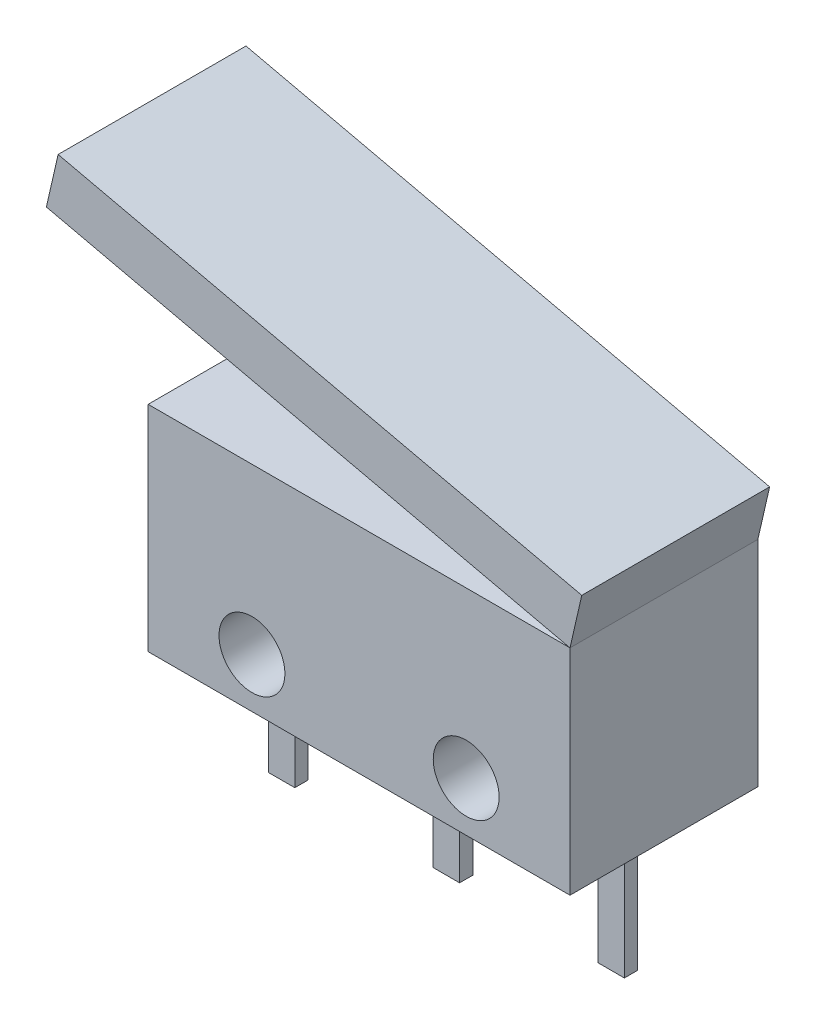
ISO-10303-21;
HEADER;
FILE_DESCRIPTION(('STEP AP214'),'2;1');
FILE_NAME('part.step','',(''),(''),'','','');
FILE_SCHEMA(('AUTOMOTIVE_DESIGN { 1 0 10303 214 1 1 1 1 }'));
ENDSEC;
DATA;
#1=APPLICATION_CONTEXT('core data for automotive mechanical design processes');
#2=APPLICATION_PROTOCOL_DEFINITION('international standard','automotive_design',2000,#1);
#3=PRODUCT_CONTEXT('',#1,'mechanical');
#4=PRODUCT('Part','Part','',(#3));
#5=PRODUCT_RELATED_PRODUCT_CATEGORY('part','',(#4));
#6=PRODUCT_DEFINITION_FORMATION('','',#4);
#7=PRODUCT_DEFINITION_CONTEXT('part definition',#1,'design');
#8=PRODUCT_DEFINITION('design','',#6,#7);
#9=PRODUCT_DEFINITION_SHAPE('','',#8);
#10=(LENGTH_UNIT() NAMED_UNIT(*) SI_UNIT(.MILLI.,.METRE.));
#11=(NAMED_UNIT(*) PLANE_ANGLE_UNIT() SI_UNIT($,.RADIAN.));
#12=(NAMED_UNIT(*) SI_UNIT($,.STERADIAN.) SOLID_ANGLE_UNIT());
#13=UNCERTAINTY_MEASURE_WITH_UNIT(LENGTH_MEASURE(1.E-05),#10,'distance_accuracy_value','');
#14=(GEOMETRIC_REPRESENTATION_CONTEXT(3) GLOBAL_UNCERTAINTY_ASSIGNED_CONTEXT((#13)) GLOBAL_UNIT_ASSIGNED_CONTEXT((#10,
#11,#12)) REPRESENTATION_CONTEXT('',''));
#15=CARTESIAN_POINT('',(0.,0.,0.));
#16=DIRECTION('',(0.,0.,1.));
#17=DIRECTION('',(1.,0.,0.));
#18=AXIS2_PLACEMENT_3D('',#15,#16,#17);
#19=CARTESIAN_POINT('',(0.,0.,5.7));
#20=DIRECTION('',(0.,1.,0.));
#21=DIRECTION('',(0.,0.,1.));
#22=AXIS2_PLACEMENT_3D('',#19,#20,#21);
#23=PLANE('',#22);
#24=DIRECTION('',(-1.,0.,0.));
#25=VECTOR('',#24,1.);
#26=CARTESIAN_POINT('',(6.,0.,3.05));
#27=LINE('',#26,#25);
#28=CARTESIAN_POINT('',(6.8,0.,3.05));
#29=VERTEX_POINT('',#28);
#30=CARTESIAN_POINT('',(6.,0.,3.05));
#31=VERTEX_POINT('',#30);
#32=EDGE_CURVE('E178',#29,#31,#27,.T.);
#33=ORIENTED_EDGE('',*,*,#32,.F.);
#34=DIRECTION('',(0.,0.,1.));
#35=VECTOR('',#34,1.);
#36=CARTESIAN_POINT('',(6.8,0.,3.05));
#37=LINE('',#36,#35);
#38=CARTESIAN_POINT('',(6.8,0.,2.65));
#39=VERTEX_POINT('',#38);
#40=EDGE_CURVE('E191',#39,#29,#37,.T.);
#41=ORIENTED_EDGE('',*,*,#40,.F.);
#42=DIRECTION('',(1.,0.,0.));
#43=VECTOR('',#42,1.);
#44=CARTESIAN_POINT('',(6.8,0.,2.65));
#45=LINE('',#44,#43);
#46=CARTESIAN_POINT('',(6.,0.,2.65));
#47=VERTEX_POINT('',#46);
#48=EDGE_CURVE('E200',#47,#39,#45,.T.);
#49=ORIENTED_EDGE('',*,*,#48,.F.);
#50=DIRECTION('',(0.,0.,-1.));
#51=VECTOR('',#50,1.);
#52=CARTESIAN_POINT('',(6.,0.,3.05));
#53=LINE('',#52,#51);
#54=EDGE_CURVE('E181',#31,#47,#53,.T.);
#55=ORIENTED_EDGE('',*,*,#54,.F.);
#56=EDGE_LOOP('',(#33,#41,#49,#55));
#57=FACE_BOUND('',#56,.T.);
#58=DIRECTION('',(1.,0.,0.));
#59=VECTOR('',#58,1.);
#60=CARTESIAN_POINT('',(0.,0.,0.));
#61=LINE('',#60,#59);
#62=CARTESIAN_POINT('',(0.,0.,0.));
#63=VERTEX_POINT('',#62);
#64=CARTESIAN_POINT('',(12.8,0.,0.));
#65=VERTEX_POINT('',#64);
#66=EDGE_CURVE('E259',#63,#65,#61,.T.);
#67=ORIENTED_EDGE('',*,*,#66,.T.);
#68=DIRECTION('',(0.,0.,-1.));
#69=VECTOR('',#68,1.);
#70=CARTESIAN_POINT('',(12.8,0.,5.7));
#71=LINE('',#70,#69);
#72=CARTESIAN_POINT('',(12.8,0.,5.7));
#73=VERTEX_POINT('',#72);
#74=EDGE_CURVE('E12',#73,#65,#71,.T.);
#75=ORIENTED_EDGE('',*,*,#74,.F.);
#76=DIRECTION('',(1.,0.,0.));
#77=VECTOR('',#76,1.);
#78=CARTESIAN_POINT('',(0.,0.,5.7));
#79=LINE('',#78,#77);
#80=CARTESIAN_POINT('',(0.,0.,5.7));
#81=VERTEX_POINT('',#80);
#82=EDGE_CURVE('E262',#81,#73,#79,.T.);
#83=ORIENTED_EDGE('',*,*,#82,.F.);
#84=DIRECTION('',(0.,0.,-1.));
#85=VECTOR('',#84,1.);
#86=CARTESIAN_POINT('',(0.,0.,5.7));
#87=LINE('',#86,#85);
#88=EDGE_CURVE('E274',#81,#63,#87,.T.);
#89=ORIENTED_EDGE('',*,*,#88,.T.);
#90=EDGE_LOOP('',(#67,#75,#83,#89));
#91=FACE_BOUND('',#90,.T.);
#92=DIRECTION('',(0.,0.,-1.));
#93=VECTOR('',#92,1.);
#94=CARTESIAN_POINT('',(1.,0.,3.05));
#95=LINE('',#94,#93);
#96=CARTESIAN_POINT('',(1.,0.,3.05));
#97=VERTEX_POINT('',#96);
#98=CARTESIAN_POINT('',(1.,0.,2.65));
#99=VERTEX_POINT('',#98);
#100=EDGE_CURVE('E216',#97,#99,#95,.T.);
#101=ORIENTED_EDGE('',*,*,#100,.F.);
#102=DIRECTION('',(-1.,0.,0.));
#103=VECTOR('',#102,1.);
#104=CARTESIAN_POINT('',(1.,0.,3.05));
#105=LINE('',#104,#103);
#106=CARTESIAN_POINT('',(1.8,0.,3.05));
#107=VERTEX_POINT('',#106);
#108=EDGE_CURVE('E221',#107,#97,#105,.T.);
#109=ORIENTED_EDGE('',*,*,#108,.F.);
#110=DIRECTION('',(0.,0.,1.));
#111=VECTOR('',#110,1.);
#112=CARTESIAN_POINT('',(1.8,0.,3.05));
#113=LINE('',#112,#111);
#114=CARTESIAN_POINT('',(1.8,0.,2.65));
#115=VERTEX_POINT('',#114);
#116=EDGE_CURVE('E233',#115,#107,#113,.T.);
#117=ORIENTED_EDGE('',*,*,#116,.F.);
#118=DIRECTION('',(1.,0.,0.));
#119=VECTOR('',#118,1.);
#120=CARTESIAN_POINT('',(1.,0.,2.65));
#121=LINE('',#120,#119);
#122=EDGE_CURVE('E230',#99,#115,#121,.T.);
#123=ORIENTED_EDGE('',*,*,#122,.F.);
#124=EDGE_LOOP('',(#101,#109,#117,#123));
#125=FACE_BOUND('',#124,.T.);
#126=DIRECTION('',(-1.,0.,0.));
#127=VECTOR('',#126,1.);
#128=CARTESIAN_POINT('',(11.8,0.,3.05));
#129=LINE('',#128,#127);
#130=CARTESIAN_POINT('',(11.8,0.,3.05));
#131=VERTEX_POINT('',#130);
#132=CARTESIAN_POINT('',(11.,0.,3.05));
#133=VERTEX_POINT('',#132);
#134=EDGE_CURVE('E177',#131,#133,#129,.T.);
#135=ORIENTED_EDGE('',*,*,#134,.F.);
#136=DIRECTION('',(0.,0.,1.));
#137=VECTOR('',#136,1.);
#138=CARTESIAN_POINT('',(11.8,0.,3.05));
#139=LINE('',#138,#137);
#140=CARTESIAN_POINT('',(11.8,0.,2.65));
#141=VERTEX_POINT('',#140);
#142=EDGE_CURVE('E174',#141,#131,#139,.T.);
#143=ORIENTED_EDGE('',*,*,#142,.F.);
#144=DIRECTION('',(1.,0.,0.));
#145=VECTOR('',#144,1.);
#146=CARTESIAN_POINT('',(11.8,0.,2.65));
#147=LINE('',#146,#145);
#148=CARTESIAN_POINT('',(11.,0.,2.65));
#149=VERTEX_POINT('',#148);
#150=EDGE_CURVE('E64',#149,#141,#147,.T.);
#151=ORIENTED_EDGE('',*,*,#150,.F.);
#152=DIRECTION('',(0.,0.,-1.));
#153=VECTOR('',#152,1.);
#154=CARTESIAN_POINT('',(11.,0.,3.05));
#155=LINE('',#154,#153);
#156=EDGE_CURVE('E59',#133,#149,#155,.T.);
#157=ORIENTED_EDGE('',*,*,#156,.F.);
#158=EDGE_LOOP('',(#135,#143,#151,#157));
#159=FACE_BOUND('',#158,.T.);
#160=ADVANCED_FACE('F45',(#57,#91,#125,#159),#23,.F.);
#161=CARTESIAN_POINT('',(12.8,0.,5.7));
#162=DIRECTION('',(-1.,0.,0.));
#163=DIRECTION('',(0.,0.,1.));
#164=AXIS2_PLACEMENT_3D('',#161,#162,#163);
#165=PLANE('',#164);
#166=DIRECTION('',(0.,1.,0.));
#167=VECTOR('',#166,1.);
#168=CARTESIAN_POINT('',(12.8,0.,0.));
#169=LINE('',#168,#167);
#170=CARTESIAN_POINT('',(12.8,6.5,0.));
#171=VERTEX_POINT('',#170);
#172=EDGE_CURVE('E277',#65,#171,#169,.T.);
#173=ORIENTED_EDGE('',*,*,#172,.T.);
#174=DIRECTION('',(0.,0.,-1.));
#175=VECTOR('',#174,1.);
#176=CARTESIAN_POINT('',(12.8,6.5,5.7));
#177=LINE('',#176,#175);
#178=CARTESIAN_POINT('',(12.8,6.5,5.7));
#179=VERTEX_POINT('',#178);
#180=EDGE_CURVE('E52',#179,#171,#177,.T.);
#181=ORIENTED_EDGE('',*,*,#180,.F.);
#182=DIRECTION('',(0.,1.,0.));
#183=VECTOR('',#182,1.);
#184=CARTESIAN_POINT('',(12.8,0.,5.7));
#185=LINE('',#184,#183);
#186=EDGE_CURVE('E265',#73,#179,#185,.T.);
#187=ORIENTED_EDGE('',*,*,#186,.F.);
#188=ORIENTED_EDGE('',*,*,#74,.T.);
#189=EDGE_LOOP('',(#173,#181,#187,#188));
#190=FACE_BOUND('',#189,.T.);
#191=ADVANCED_FACE('F293',(#190),#165,.F.);
#192=CARTESIAN_POINT('',(0.,6.5,5.7));
#193=DIRECTION('',(0.,1.,0.));
#194=DIRECTION('',(-1.,0.,0.));
#195=AXIS2_PLACEMENT_3D('',#192,#193,#194);
#196=PLANE('',#195);
#197=DIRECTION('',(1.,0.,0.));
#198=VECTOR('',#197,1.);
#199=CARTESIAN_POINT('',(0.,6.5,0.));
#200=LINE('',#199,#198);
#201=CARTESIAN_POINT('',(0.,6.5,0.));
#202=VERTEX_POINT('',#201);
#203=EDGE_CURVE('E280',#202,#171,#200,.T.);
#204=ORIENTED_EDGE('',*,*,#203,.F.);
#205=DIRECTION('',(0.,0.,-1.));
#206=VECTOR('',#205,1.);
#207=CARTESIAN_POINT('',(0.,6.5,5.7));
#208=LINE('',#207,#206);
#209=CARTESIAN_POINT('',(0.,6.5,5.7));
#210=VERTEX_POINT('',#209);
#211=EDGE_CURVE('E286',#210,#202,#208,.T.);
#212=ORIENTED_EDGE('',*,*,#211,.F.);
#213=DIRECTION('',(1.,0.,0.));
#214=VECTOR('',#213,1.);
#215=CARTESIAN_POINT('',(0.,6.5,5.7));
#216=LINE('',#215,#214);
#217=EDGE_CURVE('E268',#210,#179,#216,.T.);
#218=ORIENTED_EDGE('',*,*,#217,.T.);
#219=ORIENTED_EDGE('',*,*,#180,.T.);
#220=EDGE_LOOP('',(#204,#212,#218,#219));
#221=FACE_BOUND('',#220,.T.);
#222=ADVANCED_FACE('F290',(#221),#196,.T.);
#223=CARTESIAN_POINT('',(0.,0.,5.7));
#224=DIRECTION('',(-1.,0.,0.));
#225=DIRECTION('',(0.,0.,1.));
#226=AXIS2_PLACEMENT_3D('',#223,#224,#225);
#227=PLANE('',#226);
#228=DIRECTION('',(0.,1.,0.));
#229=VECTOR('',#228,1.);
#230=CARTESIAN_POINT('',(0.,0.,0.));
#231=LINE('',#230,#229);
#232=EDGE_CURVE('E266',#63,#202,#231,.T.);
#233=ORIENTED_EDGE('',*,*,#232,.F.);
#234=ORIENTED_EDGE('',*,*,#88,.F.);
#235=DIRECTION('',(0.,1.,0.));
#236=VECTOR('',#235,1.);
#237=CARTESIAN_POINT('',(0.,0.,5.7));
#238=LINE('',#237,#236);
#239=EDGE_CURVE('E271',#81,#210,#238,.T.);
#240=ORIENTED_EDGE('',*,*,#239,.T.);
#241=ORIENTED_EDGE('',*,*,#211,.T.);
#242=EDGE_LOOP('',(#233,#234,#240,#241));
#243=FACE_BOUND('',#242,.T.);
#244=ADVANCED_FACE('F300',(#243),#227,.T.);
#245=CARTESIAN_POINT('',(0.,0.,5.7));
#246=DIRECTION('',(0.,0.,1.));
#247=DIRECTION('',(1.,0.,0.));
#248=AXIS2_PLACEMENT_3D('',#245,#246,#247);
#249=PLANE('',#248);
#250=CARTESIAN_POINT('',(9.65,1.5,5.7));
#251=DIRECTION('',(0.,0.,1.));
#252=DIRECTION('',(-1.,0.,0.));
#253=AXIS2_PLACEMENT_3D('',#250,#251,#252);
#254=CIRCLE('',#253,1.);
#255=CARTESIAN_POINT('',(8.65000000000001,1.5,5.7));
#256=VERTEX_POINT('',#255);
#257=EDGE_CURVE('E249',#256,#256,#254,.T.);
#258=ORIENTED_EDGE('',*,*,#257,.F.);
#259=EDGE_LOOP('',(#258));
#260=FACE_BOUND('',#259,.T.);
#261=CARTESIAN_POINT('',(3.15,1.5,5.7));
#262=DIRECTION('',(0.,0.,1.));
#263=DIRECTION('',(1.,0.,0.));
#264=AXIS2_PLACEMENT_3D('',#261,#262,#263);
#265=CIRCLE('',#264,1.);
#266=CARTESIAN_POINT('',(4.15,1.5,5.7));
#267=VERTEX_POINT('',#266);
#268=EDGE_CURVE('E253',#267,#267,#265,.T.);
#269=ORIENTED_EDGE('',*,*,#268,.F.);
#270=EDGE_LOOP('',(#269));
#271=FACE_BOUND('',#270,.T.);
#272=ORIENTED_EDGE('',*,*,#82,.T.);
#273=ORIENTED_EDGE('',*,*,#186,.T.);
#274=ORIENTED_EDGE('',*,*,#217,.F.);
#275=ORIENTED_EDGE('',*,*,#239,.F.);
#276=EDGE_LOOP('',(#272,#273,#274,#275));
#277=FACE_BOUND('',#276,.T.);
#278=ADVANCED_FACE('F304',(#260,#271,#277),#249,.T.);
#279=CARTESIAN_POINT('',(0.,0.,0.));
#280=DIRECTION('',(0.,0.,1.));
#281=DIRECTION('',(1.,0.,0.));
#282=AXIS2_PLACEMENT_3D('',#279,#280,#281);
#283=PLANE('',#282);
#284=CARTESIAN_POINT('',(9.65,1.5,0.));
#285=DIRECTION('',(0.,0.,1.));
#286=DIRECTION('',(-1.,0.,0.));
#287=AXIS2_PLACEMENT_3D('',#284,#285,#286);
#288=CIRCLE('',#287,1.);
#289=CARTESIAN_POINT('',(8.65000000000001,1.5,0.));
#290=VERTEX_POINT('',#289);
#291=EDGE_CURVE('E250',#290,#290,#288,.T.);
#292=ORIENTED_EDGE('',*,*,#291,.T.);
#293=EDGE_LOOP('',(#292));
#294=FACE_BOUND('',#293,.T.);
#295=CARTESIAN_POINT('',(3.15,1.5,0.));
#296=DIRECTION('',(0.,0.,1.));
#297=DIRECTION('',(1.,0.,0.));
#298=AXIS2_PLACEMENT_3D('',#295,#296,#297);
#299=CIRCLE('',#298,1.);
#300=CARTESIAN_POINT('',(4.15,1.5,0.));
#301=VERTEX_POINT('',#300);
#302=EDGE_CURVE('E256',#301,#301,#299,.T.);
#303=ORIENTED_EDGE('',*,*,#302,.T.);
#304=EDGE_LOOP('',(#303));
#305=FACE_BOUND('',#304,.T.);
#306=ORIENTED_EDGE('',*,*,#66,.F.);
#307=ORIENTED_EDGE('',*,*,#232,.T.);
#308=ORIENTED_EDGE('',*,*,#203,.T.);
#309=ORIENTED_EDGE('',*,*,#172,.F.);
#310=EDGE_LOOP('',(#306,#307,#308,#309));
#311=FACE_BOUND('',#310,.T.);
#312=ADVANCED_FACE('F297',(#294,#305,#311),#283,.F.);
#313=CARTESIAN_POINT('',(3.15,1.5,0.));
#314=DIRECTION('',(0.,0.,1.));
#315=DIRECTION('',(1.,0.,0.));
#316=AXIS2_PLACEMENT_3D('',#313,#314,#315);
#317=CYLINDRICAL_SURFACE('',#316,1.);
#318=ORIENTED_EDGE('',*,*,#302,.F.);
#319=EDGE_LOOP('',(#318));
#320=FACE_BOUND('',#319,.T.);
#321=ORIENTED_EDGE('',*,*,#268,.T.);
#322=EDGE_LOOP('',(#321));
#323=FACE_BOUND('',#322,.T.);
#324=ADVANCED_FACE('F379',(#320,#323),#317,.F.);
#325=CARTESIAN_POINT('',(9.65,1.5,0.));
#326=DIRECTION('',(0.,0.,1.));
#327=DIRECTION('',(1.,0.,0.));
#328=AXIS2_PLACEMENT_3D('',#325,#326,#327);
#329=CYLINDRICAL_SURFACE('',#328,1.);
#330=ORIENTED_EDGE('',*,*,#291,.F.);
#331=EDGE_LOOP('',(#330));
#332=FACE_BOUND('',#331,.T.);
#333=ORIENTED_EDGE('',*,*,#257,.T.);
#334=EDGE_LOOP('',(#333));
#335=FACE_BOUND('',#334,.T.);
#336=ADVANCED_FACE('F375',(#332,#335),#329,.F.);
#337=CARTESIAN_POINT('',(1.,-4.,3.05));
#338=DIRECTION('',(1.,0.,0.));
#339=DIRECTION('',(0.,0.,-1.));
#340=AXIS2_PLACEMENT_3D('',#337,#338,#339);
#341=PLANE('',#340);
#342=ORIENTED_EDGE('',*,*,#100,.T.);
#343=DIRECTION('',(0.,1.,0.));
#344=VECTOR('',#343,1.);
#345=CARTESIAN_POINT('',(1.,-4.,2.65));
#346=LINE('',#345,#344);
#347=CARTESIAN_POINT('',(1.,-4.,2.65));
#348=VERTEX_POINT('',#347);
#349=EDGE_CURVE('E246',#348,#99,#346,.T.);
#350=ORIENTED_EDGE('',*,*,#349,.F.);
#351=DIRECTION('',(0.,0.,-1.));
#352=VECTOR('',#351,1.);
#353=CARTESIAN_POINT('',(1.,-4.,3.05));
#354=LINE('',#353,#352);
#355=CARTESIAN_POINT('',(1.,-4.,3.05));
#356=VERTEX_POINT('',#355);
#357=EDGE_CURVE('E217',#356,#348,#354,.T.);
#358=ORIENTED_EDGE('',*,*,#357,.F.);
#359=DIRECTION('',(0.,1.,0.));
#360=VECTOR('',#359,1.);
#361=CARTESIAN_POINT('',(1.,-4.,3.05));
#362=LINE('',#361,#360);
#363=EDGE_CURVE('E227',#356,#97,#362,.T.);
#364=ORIENTED_EDGE('',*,*,#363,.T.);
#365=EDGE_LOOP('',(#342,#350,#358,#364));
#366=FACE_BOUND('',#365,.T.);
#367=ADVANCED_FACE('F371',(#366),#341,.F.);
#368=CARTESIAN_POINT('',(1.,-4.,2.65));
#369=DIRECTION('',(0.,0.,1.));
#370=DIRECTION('',(1.,0.,0.));
#371=AXIS2_PLACEMENT_3D('',#368,#369,#370);
#372=PLANE('',#371);
#373=ORIENTED_EDGE('',*,*,#122,.T.);
#374=DIRECTION('',(0.,1.,0.));
#375=VECTOR('',#374,1.);
#376=CARTESIAN_POINT('',(1.8,-4.,2.65));
#377=LINE('',#376,#375);
#378=CARTESIAN_POINT('',(1.8,-4.,2.65));
#379=VERTEX_POINT('',#378);
#380=EDGE_CURVE('E243',#379,#115,#377,.T.);
#381=ORIENTED_EDGE('',*,*,#380,.F.);
#382=DIRECTION('',(1.,0.,0.));
#383=VECTOR('',#382,1.);
#384=CARTESIAN_POINT('',(1.,-4.,2.65));
#385=LINE('',#384,#383);
#386=EDGE_CURVE('E220',#348,#379,#385,.T.);
#387=ORIENTED_EDGE('',*,*,#386,.F.);
#388=ORIENTED_EDGE('',*,*,#349,.T.);
#389=EDGE_LOOP('',(#373,#381,#387,#388));
#390=FACE_BOUND('',#389,.T.);
#391=ADVANCED_FACE('F367',(#390),#372,.F.);
#392=CARTESIAN_POINT('',(1.8,-4.,3.05));
#393=DIRECTION('',(-1.,0.,0.));
#394=DIRECTION('',(0.,0.,1.));
#395=AXIS2_PLACEMENT_3D('',#392,#393,#394);
#396=PLANE('',#395);
#397=ORIENTED_EDGE('',*,*,#116,.T.);
#398=DIRECTION('',(0.,1.,0.));
#399=VECTOR('',#398,1.);
#400=CARTESIAN_POINT('',(1.8,-4.,3.05));
#401=LINE('',#400,#399);
#402=CARTESIAN_POINT('',(1.8,-4.,3.05));
#403=VERTEX_POINT('',#402);
#404=EDGE_CURVE('E240',#403,#107,#401,.T.);
#405=ORIENTED_EDGE('',*,*,#404,.F.);
#406=DIRECTION('',(0.,0.,1.));
#407=VECTOR('',#406,1.);
#408=CARTESIAN_POINT('',(1.8,-4.,3.05));
#409=LINE('',#408,#407);
#410=EDGE_CURVE('E223',#379,#403,#409,.T.);
#411=ORIENTED_EDGE('',*,*,#410,.F.);
#412=ORIENTED_EDGE('',*,*,#380,.T.);
#413=EDGE_LOOP('',(#397,#405,#411,#412));
#414=FACE_BOUND('',#413,.T.);
#415=ADVANCED_FACE('F363',(#414),#396,.F.);
#416=CARTESIAN_POINT('',(1.,-4.,3.05));
#417=DIRECTION('',(0.,0.,-1.));
#418=DIRECTION('',(-1.,0.,0.));
#419=AXIS2_PLACEMENT_3D('',#416,#417,#418);
#420=PLANE('',#419);
#421=ORIENTED_EDGE('',*,*,#108,.T.);
#422=ORIENTED_EDGE('',*,*,#363,.F.);
#423=DIRECTION('',(-1.,0.,0.));
#424=VECTOR('',#423,1.);
#425=CARTESIAN_POINT('',(1.,-4.,3.05));
#426=LINE('',#425,#424);
#427=EDGE_CURVE('E225',#403,#356,#426,.T.);
#428=ORIENTED_EDGE('',*,*,#427,.F.);
#429=ORIENTED_EDGE('',*,*,#404,.T.);
#430=EDGE_LOOP('',(#421,#422,#428,#429));
#431=FACE_BOUND('',#430,.T.);
#432=ADVANCED_FACE('F359',(#431),#420,.F.);
#433=CARTESIAN_POINT('',(0.,-4.,0.));
#434=DIRECTION('',(0.,-1.,0.));
#435=DIRECTION('',(0.,0.,-1.));
#436=AXIS2_PLACEMENT_3D('',#433,#434,#435);
#437=PLANE('',#436);
#438=ORIENTED_EDGE('',*,*,#357,.T.);
#439=ORIENTED_EDGE('',*,*,#386,.T.);
#440=ORIENTED_EDGE('',*,*,#410,.T.);
#441=ORIENTED_EDGE('',*,*,#427,.T.);
#442=EDGE_LOOP('',(#438,#439,#440,#441));
#443=FACE_BOUND('',#442,.T.);
#444=ADVANCED_FACE('F355',(#443),#437,.T.);
#445=CARTESIAN_POINT('',(6.,-4.,3.05));
#446=DIRECTION('',(0.,0.,-1.));
#447=DIRECTION('',(-1.,0.,0.));
#448=AXIS2_PLACEMENT_3D('',#445,#446,#447);
#449=PLANE('',#448);
#450=ORIENTED_EDGE('',*,*,#32,.T.);
#451=DIRECTION('',(0.,1.,0.));
#452=VECTOR('',#451,1.);
#453=CARTESIAN_POINT('',(6.,-4.,3.05));
#454=LINE('',#453,#452);
#455=CARTESIAN_POINT('',(6.,-4.,3.05));
#456=VERTEX_POINT('',#455);
#457=EDGE_CURVE('E213',#456,#31,#454,.T.);
#458=ORIENTED_EDGE('',*,*,#457,.F.);
#459=DIRECTION('',(-1.,0.,0.));
#460=VECTOR('',#459,1.);
#461=CARTESIAN_POINT('',(6.,-4.,3.05));
#462=LINE('',#461,#460);
#463=CARTESIAN_POINT('',(6.8,-4.,3.05));
#464=VERTEX_POINT('',#463);
#465=EDGE_CURVE('E187',#464,#456,#462,.T.);
#466=ORIENTED_EDGE('',*,*,#465,.F.);
#467=DIRECTION('',(0.,1.,0.));
#468=VECTOR('',#467,1.);
#469=CARTESIAN_POINT('',(6.8,-4.,3.05));
#470=LINE('',#469,#468);
#471=EDGE_CURVE('E196',#464,#29,#470,.T.);
#472=ORIENTED_EDGE('',*,*,#471,.T.);
#473=EDGE_LOOP('',(#450,#458,#466,#472));
#474=FACE_BOUND('',#473,.T.);
#475=ADVANCED_FACE('F351',(#474),#449,.F.);
#476=CARTESIAN_POINT('',(6.,-4.,3.05));
#477=DIRECTION('',(1.,0.,0.));
#478=DIRECTION('',(0.,0.,-1.));
#479=AXIS2_PLACEMENT_3D('',#476,#477,#478);
#480=PLANE('',#479);
#481=ORIENTED_EDGE('',*,*,#54,.T.);
#482=DIRECTION('',(0.,1.,0.));
#483=VECTOR('',#482,1.);
#484=CARTESIAN_POINT('',(6.,-4.,2.65));
#485=LINE('',#484,#483);
#486=CARTESIAN_POINT('',(6.,-4.,2.65));
#487=VERTEX_POINT('',#486);
#488=EDGE_CURVE('E210',#487,#47,#485,.T.);
#489=ORIENTED_EDGE('',*,*,#488,.F.);
#490=DIRECTION('',(0.,0.,-1.));
#491=VECTOR('',#490,1.);
#492=CARTESIAN_POINT('',(6.,-4.,3.05));
#493=LINE('',#492,#491);
#494=EDGE_CURVE('E190',#456,#487,#493,.T.);
#495=ORIENTED_EDGE('',*,*,#494,.F.);
#496=ORIENTED_EDGE('',*,*,#457,.T.);
#497=EDGE_LOOP('',(#481,#489,#495,#496));
#498=FACE_BOUND('',#497,.T.);
#499=ADVANCED_FACE('F347',(#498),#480,.F.);
#500=CARTESIAN_POINT('',(6.8,-4.,2.65));
#501=DIRECTION('',(0.,0.,1.));
#502=DIRECTION('',(1.,0.,0.));
#503=AXIS2_PLACEMENT_3D('',#500,#501,#502);
#504=PLANE('',#503);
#505=ORIENTED_EDGE('',*,*,#48,.T.);
#506=DIRECTION('',(0.,1.,0.));
#507=VECTOR('',#506,1.);
#508=CARTESIAN_POINT('',(6.8,-4.,2.65));
#509=LINE('',#508,#507);
#510=CARTESIAN_POINT('',(6.8,-4.,2.65));
#511=VERTEX_POINT('',#510);
#512=EDGE_CURVE('E207',#511,#39,#509,.T.);
#513=ORIENTED_EDGE('',*,*,#512,.F.);
#514=DIRECTION('',(1.,0.,0.));
#515=VECTOR('',#514,1.);
#516=CARTESIAN_POINT('',(6.8,-4.,2.65));
#517=LINE('',#516,#515);
#518=EDGE_CURVE('E193',#487,#511,#517,.T.);
#519=ORIENTED_EDGE('',*,*,#518,.F.);
#520=ORIENTED_EDGE('',*,*,#488,.T.);
#521=EDGE_LOOP('',(#505,#513,#519,#520));
#522=FACE_BOUND('',#521,.T.);
#523=ADVANCED_FACE('F343',(#522),#504,.F.);
#524=CARTESIAN_POINT('',(6.8,-4.,3.05));
#525=DIRECTION('',(-1.,0.,0.));
#526=DIRECTION('',(0.,0.,1.));
#527=AXIS2_PLACEMENT_3D('',#524,#525,#526);
#528=PLANE('',#527);
#529=ORIENTED_EDGE('',*,*,#40,.T.);
#530=ORIENTED_EDGE('',*,*,#471,.F.);
#531=DIRECTION('',(0.,0.,1.));
#532=VECTOR('',#531,1.);
#533=CARTESIAN_POINT('',(6.8,-4.,3.05));
#534=LINE('',#533,#532);
#535=EDGE_CURVE('E195',#511,#464,#534,.T.);
#536=ORIENTED_EDGE('',*,*,#535,.F.);
#537=ORIENTED_EDGE('',*,*,#512,.T.);
#538=EDGE_LOOP('',(#529,#530,#536,#537));
#539=FACE_BOUND('',#538,.T.);
#540=ADVANCED_FACE('F339',(#539),#528,.F.);
#541=CARTESIAN_POINT('',(0.,-4.,0.));
#542=DIRECTION('',(0.,1.,0.));
#543=DIRECTION('',(0.,0.,1.));
#544=AXIS2_PLACEMENT_3D('',#541,#542,#543);
#545=PLANE('',#544);
#546=ORIENTED_EDGE('',*,*,#465,.T.);
#547=ORIENTED_EDGE('',*,*,#494,.T.);
#548=ORIENTED_EDGE('',*,*,#518,.T.);
#549=ORIENTED_EDGE('',*,*,#535,.T.);
#550=EDGE_LOOP('',(#546,#547,#548,#549));
#551=FACE_BOUND('',#550,.T.);
#552=ADVANCED_FACE('F336',(#551),#545,.F.);
#553=CARTESIAN_POINT('',(11.8,-4.,3.05));
#554=DIRECTION('',(0.,0.,-1.));
#555=DIRECTION('',(-1.,0.,0.));
#556=AXIS2_PLACEMENT_3D('',#553,#554,#555);
#557=PLANE('',#556);
#558=ORIENTED_EDGE('',*,*,#134,.T.);
#559=DIRECTION('',(0.,1.,0.));
#560=VECTOR('',#559,1.);
#561=CARTESIAN_POINT('',(11.,-4.,3.05));
#562=LINE('',#561,#560);
#563=CARTESIAN_POINT('',(11.,-4.,3.05));
#564=VERTEX_POINT('',#563);
#565=EDGE_CURVE('E158',#564,#133,#562,.T.);
#566=ORIENTED_EDGE('',*,*,#565,.F.);
#567=DIRECTION('',(-1.,0.,0.));
#568=VECTOR('',#567,1.);
#569=CARTESIAN_POINT('',(11.8,-4.,3.05));
#570=LINE('',#569,#568);
#571=CARTESIAN_POINT('',(11.8,-4.,3.05));
#572=VERTEX_POINT('',#571);
#573=EDGE_CURVE('E165',#572,#564,#570,.T.);
#574=ORIENTED_EDGE('',*,*,#573,.F.);
#575=DIRECTION('',(0.,1.,0.));
#576=VECTOR('',#575,1.);
#577=CARTESIAN_POINT('',(11.8,-4.,3.05));
#578=LINE('',#577,#576);
#579=EDGE_CURVE('E314',#572,#131,#578,.T.);
#580=ORIENTED_EDGE('',*,*,#579,.T.);
#581=EDGE_LOOP('',(#558,#566,#574,#580));
#582=FACE_BOUND('',#581,.T.);
#583=ADVANCED_FACE('F176',(#582),#557,.F.);
#584=CARTESIAN_POINT('',(11.,-4.,3.05));
#585=DIRECTION('',(1.,0.,0.));
#586=DIRECTION('',(0.,0.,-1.));
#587=AXIS2_PLACEMENT_3D('',#584,#585,#586);
#588=PLANE('',#587);
#589=ORIENTED_EDGE('',*,*,#156,.T.);
#590=DIRECTION('',(0.,1.,0.));
#591=VECTOR('',#590,1.);
#592=CARTESIAN_POINT('',(11.,-4.,2.65));
#593=LINE('',#592,#591);
#594=CARTESIAN_POINT('',(11.,-4.,2.65));
#595=VERTEX_POINT('',#594);
#596=EDGE_CURVE('E161',#595,#149,#593,.T.);
#597=ORIENTED_EDGE('',*,*,#596,.F.);
#598=DIRECTION('',(0.,0.,-1.));
#599=VECTOR('',#598,1.);
#600=CARTESIAN_POINT('',(11.,-4.,3.05));
#601=LINE('',#600,#599);
#602=EDGE_CURVE('E154',#564,#595,#601,.T.);
#603=ORIENTED_EDGE('',*,*,#602,.F.);
#604=ORIENTED_EDGE('',*,*,#565,.T.);
#605=EDGE_LOOP('',(#589,#597,#603,#604));
#606=FACE_BOUND('',#605,.T.);
#607=ADVANCED_FACE('F156',(#606),#588,.F.);
#608=CARTESIAN_POINT('',(11.8,-4.,2.65));
#609=DIRECTION('',(0.,0.,1.));
#610=DIRECTION('',(1.,0.,0.));
#611=AXIS2_PLACEMENT_3D('',#608,#609,#610);
#612=PLANE('',#611);
#613=ORIENTED_EDGE('',*,*,#150,.T.);
#614=DIRECTION('',(0.,1.,0.));
#615=VECTOR('',#614,1.);
#616=CARTESIAN_POINT('',(11.8,-4.,2.65));
#617=LINE('',#616,#615);
#618=CARTESIAN_POINT('',(11.8,-4.,2.65));
#619=VERTEX_POINT('',#618);
#620=EDGE_CURVE('E183',#619,#141,#617,.T.);
#621=ORIENTED_EDGE('',*,*,#620,.F.);
#622=DIRECTION('',(1.,0.,0.));
#623=VECTOR('',#622,1.);
#624=CARTESIAN_POINT('',(11.8,-4.,2.65));
#625=LINE('',#624,#623);
#626=EDGE_CURVE('E164',#595,#619,#625,.T.);
#627=ORIENTED_EDGE('',*,*,#626,.F.);
#628=ORIENTED_EDGE('',*,*,#596,.T.);
#629=EDGE_LOOP('',(#613,#621,#627,#628));
#630=FACE_BOUND('',#629,.T.);
#631=ADVANCED_FACE('F323',(#630),#612,.F.);
#632=CARTESIAN_POINT('',(11.8,-4.,3.05));
#633=DIRECTION('',(-1.,0.,0.));
#634=DIRECTION('',(0.,0.,1.));
#635=AXIS2_PLACEMENT_3D('',#632,#633,#634);
#636=PLANE('',#635);
#637=ORIENTED_EDGE('',*,*,#142,.T.);
#638=ORIENTED_EDGE('',*,*,#579,.F.);
#639=DIRECTION('',(0.,0.,1.));
#640=VECTOR('',#639,1.);
#641=CARTESIAN_POINT('',(11.8,-4.,3.05));
#642=LINE('',#641,#640);
#643=EDGE_CURVE('E170',#619,#572,#642,.T.);
#644=ORIENTED_EDGE('',*,*,#643,.F.);
#645=ORIENTED_EDGE('',*,*,#620,.T.);
#646=EDGE_LOOP('',(#637,#638,#644,#645));
#647=FACE_BOUND('',#646,.T.);
#648=ADVANCED_FACE('F313',(#647),#636,.F.);
#649=CARTESIAN_POINT('',(0.,-4.,0.));
#650=DIRECTION('',(0.,-1.,0.));
#651=DIRECTION('',(0.,0.,-1.));
#652=AXIS2_PLACEMENT_3D('',#649,#650,#651);
#653=PLANE('',#652);
#654=ORIENTED_EDGE('',*,*,#573,.T.);
#655=ORIENTED_EDGE('',*,*,#602,.T.);
#656=ORIENTED_EDGE('',*,*,#626,.T.);
#657=ORIENTED_EDGE('',*,*,#643,.T.);
#658=EDGE_LOOP('',(#654,#655,#656,#657));
#659=FACE_BOUND('',#658,.T.);
#660=ADVANCED_FACE('F168',(#659),#653,.T.);
#661=CLOSED_SHELL('',(#160,#191,#222,#244,#278,#312,#324,#336,#367,#391,#415,#432,#444,#475,
#499,#523,#540,#552,#583,#607,#631,#648,#660));
#662=MANIFOLD_SOLID_BREP('B2',#661);
#663=CARTESIAN_POINT('',(10.7465054827798,-2.46230164541101,5.7));
#664=DIRECTION('',(-0.974740991424244,0.223338307590259,0.));
#665=DIRECTION('',(-0.22333830759026,-0.974740991424244,0.));
#666=AXIS2_PLACEMENT_3D('',#663,#664,#665);
#667=PLANE('',#666);
#668=DIRECTION('',(0.22333830759026,0.974740991424244,0.));
#669=VECTOR('',#668,1.);
#670=CARTESIAN_POINT('',(10.7465054827798,-2.46230164541101,0.));
#671=LINE('',#670,#669);
#672=CARTESIAN_POINT('',(12.8,6.5,0.));
#673=VERTEX_POINT('',#672);
#674=CARTESIAN_POINT('',(13.1573412921444,8.05958558627879,0.));
#675=VERTEX_POINT('',#674);
#676=EDGE_CURVE('E619',#673,#675,#671,.T.);
#677=ORIENTED_EDGE('',*,*,#676,.T.);
#678=DIRECTION('',(0.,0.,-1.));
#679=VECTOR('',#678,1.);
#680=CARTESIAN_POINT('',(13.1573412921444,8.05958558627879,5.7));
#681=LINE('',#680,#679);
#682=CARTESIAN_POINT('',(13.1573412921444,8.05958558627879,5.7));
#683=VERTEX_POINT('',#682);
#684=EDGE_CURVE('E43',#683,#675,#681,.T.);
#685=ORIENTED_EDGE('',*,*,#684,.F.);
#686=DIRECTION('',(0.22333830759026,0.974740991424244,0.));
#687=VECTOR('',#686,1.);
#688=CARTESIAN_POINT('',(10.7465054827798,-2.46230164541101,5.7));
#689=LINE('',#688,#687);
#690=CARTESIAN_POINT('',(12.8,6.5,5.7));
#691=VERTEX_POINT('',#690);
#692=EDGE_CURVE('E605',#691,#683,#689,.T.);
#693=ORIENTED_EDGE('',*,*,#692,.F.);
#694=DIRECTION('',(0.,0.,-1.));
#695=VECTOR('',#694,1.);
#696=CARTESIAN_POINT('',(12.8,6.5,5.7));
#697=LINE('',#696,#695);
#698=EDGE_CURVE('E572',#691,#673,#697,.T.);
#699=ORIENTED_EDGE('',*,*,#698,.T.);
#700=EDGE_LOOP('',(#677,#685,#693,#699));
#701=FACE_BOUND('',#700,.T.);
#702=ADVANCED_FACE('F556',(#701),#667,.F.);
#703=CARTESIAN_POINT('',(2.41083580936462,10.5218872316898,5.7));
#704=DIRECTION('',(-0.223338307590258,-0.974740991424245,0.));
#705=DIRECTION('',(0.974740991424245,-0.223338307590258,0.));
#706=AXIS2_PLACEMENT_3D('',#703,#704,#705);
#707=PLANE('',#706);
#708=DIRECTION('',(-0.974740991424245,0.223338307590258,0.));
#709=VECTOR('',#708,1.);
#710=CARTESIAN_POINT('',(2.41083580936462,10.5218872316898,0.));
#711=LINE('',#710,#709);
#712=CARTESIAN_POINT('',(-2.73093686807077,11.7,0.));
#713=VERTEX_POINT('',#712);
#714=EDGE_CURVE('E610',#675,#713,#711,.T.);
#715=ORIENTED_EDGE('',*,*,#714,.T.);
#716=DIRECTION('',(0.,0.,-1.));
#717=VECTOR('',#716,1.);
#718=CARTESIAN_POINT('',(-2.73093686807077,11.7,5.7));
#719=LINE('',#718,#717);
#720=CARTESIAN_POINT('',(-2.73093686807077,11.7,5.7));
#721=VERTEX_POINT('',#720);
#722=EDGE_CURVE('E564',#721,#713,#719,.T.);
#723=ORIENTED_EDGE('',*,*,#722,.F.);
#724=DIRECTION('',(-0.974740991424245,0.223338307590258,0.));
#725=VECTOR('',#724,1.);
#726=CARTESIAN_POINT('',(2.41083580936462,10.5218872316898,5.7));
#727=LINE('',#726,#725);
#728=EDGE_CURVE('E597',#683,#721,#727,.T.);
#729=ORIENTED_EDGE('',*,*,#728,.F.);
#730=ORIENTED_EDGE('',*,*,#684,.T.);
#731=EDGE_LOOP('',(#715,#723,#729,#730));
#732=FACE_BOUND('',#731,.T.);
#733=ADVANCED_FACE('F609',(#732),#707,.F.);
#734=CARTESIAN_POINT('',(-5.14177267743541,1.17811276831022,5.7));
#735=DIRECTION('',(-0.974740991424244,0.22333830759026,0.));
#736=DIRECTION('',(-0.22333830759026,-0.974740991424244,0.));
#737=AXIS2_PLACEMENT_3D('',#734,#735,#736);
#738=PLANE('',#737);
#739=DIRECTION('',(0.22333830759026,0.974740991424244,0.));
#740=VECTOR('',#739,1.);
#741=CARTESIAN_POINT('',(-5.14177267743541,1.17811276831022,0.));
#742=LINE('',#741,#740);
#743=CARTESIAN_POINT('',(-3.08827816021518,10.1404144137212,0.));
#744=VERTEX_POINT('',#743);
#745=EDGE_CURVE('E622',#744,#713,#742,.T.);
#746=ORIENTED_EDGE('',*,*,#745,.F.);
#747=DIRECTION('',(0.,0.,-1.));
#748=VECTOR('',#747,1.);
#749=CARTESIAN_POINT('',(-3.08827816021518,10.1404144137212,5.7));
#750=LINE('',#749,#748);
#751=CARTESIAN_POINT('',(-3.08827816021518,10.1404144137212,5.7));
#752=VERTEX_POINT('',#751);
#753=EDGE_CURVE('E586',#752,#744,#750,.T.);
#754=ORIENTED_EDGE('',*,*,#753,.F.);
#755=DIRECTION('',(0.22333830759026,0.974740991424244,0.));
#756=VECTOR('',#755,1.);
#757=CARTESIAN_POINT('',(-5.14177267743541,1.17811276831022,5.7));
#758=LINE('',#757,#756);
#759=EDGE_CURVE('E604',#752,#721,#758,.T.);
#760=ORIENTED_EDGE('',*,*,#759,.T.);
#761=ORIENTED_EDGE('',*,*,#722,.T.);
#762=EDGE_LOOP('',(#746,#754,#760,#761));
#763=FACE_BOUND('',#762,.T.);
#764=ADVANCED_FACE('F613',(#763),#738,.T.);
#765=CARTESIAN_POINT('',(2.05349451722021,8.962301645411,5.7));
#766=DIRECTION('',(-0.223338307590258,-0.974740991424245,0.));
#767=DIRECTION('',(0.974740991424245,-0.223338307590258,0.));
#768=AXIS2_PLACEMENT_3D('',#765,#766,#767);
#769=PLANE('',#768);
#770=DIRECTION('',(-0.974740991424245,0.223338307590258,0.));
#771=VECTOR('',#770,1.);
#772=CARTESIAN_POINT('',(2.05349451722021,8.962301645411,0.));
#773=LINE('',#772,#771);
#774=EDGE_CURVE('E624',#673,#744,#773,.T.);
#775=ORIENTED_EDGE('',*,*,#774,.F.);
#776=ORIENTED_EDGE('',*,*,#698,.F.);
#777=DIRECTION('',(-0.974740991424245,0.223338307590258,0.));
#778=VECTOR('',#777,1.);
#779=CARTESIAN_POINT('',(2.05349451722021,8.962301645411,5.7));
#780=LINE('',#779,#778);
#781=EDGE_CURVE('E614',#691,#752,#780,.T.);
#782=ORIENTED_EDGE('',*,*,#781,.T.);
#783=ORIENTED_EDGE('',*,*,#753,.T.);
#784=EDGE_LOOP('',(#775,#776,#782,#783));
#785=FACE_BOUND('',#784,.T.);
#786=ADVANCED_FACE('F630',(#785),#769,.T.);
#787=CARTESIAN_POINT('',(0.,0.,5.7));
#788=DIRECTION('',(0.,0.,1.));
#789=DIRECTION('',(1.,0.,0.));
#790=AXIS2_PLACEMENT_3D('',#787,#788,#789);
#791=PLANE('',#790);
#792=ORIENTED_EDGE('',*,*,#692,.T.);
#793=ORIENTED_EDGE('',*,*,#728,.T.);
#794=ORIENTED_EDGE('',*,*,#759,.F.);
#795=ORIENTED_EDGE('',*,*,#781,.F.);
#796=EDGE_LOOP('',(#792,#793,#794,#795));
#797=FACE_BOUND('',#796,.T.);
#798=ADVANCED_FACE('F601',(#797),#791,.T.);
#799=CARTESIAN_POINT('',(0.,0.,0.));
#800=DIRECTION('',(0.,0.,1.));
#801=DIRECTION('',(1.,0.,0.));
#802=AXIS2_PLACEMENT_3D('',#799,#800,#801);
#803=PLANE('',#802);
#804=ORIENTED_EDGE('',*,*,#676,.F.);
#805=ORIENTED_EDGE('',*,*,#774,.T.);
#806=ORIENTED_EDGE('',*,*,#745,.T.);
#807=ORIENTED_EDGE('',*,*,#714,.F.);
#808=EDGE_LOOP('',(#804,#805,#806,#807));
#809=FACE_BOUND('',#808,.T.);
#810=ADVANCED_FACE('F629',(#809),#803,.F.);
#811=CLOSED_SHELL('',(#702,#733,#764,#786,#798,#810));
#812=MANIFOLD_SOLID_BREP('B6',#811);
#813=ADVANCED_BREP_SHAPE_REPRESENTATION('',(#18,#662,#812),#14);
#814=SHAPE_DEFINITION_REPRESENTATION(#9,#813);
ENDSEC;
END-ISO-10303-21;
